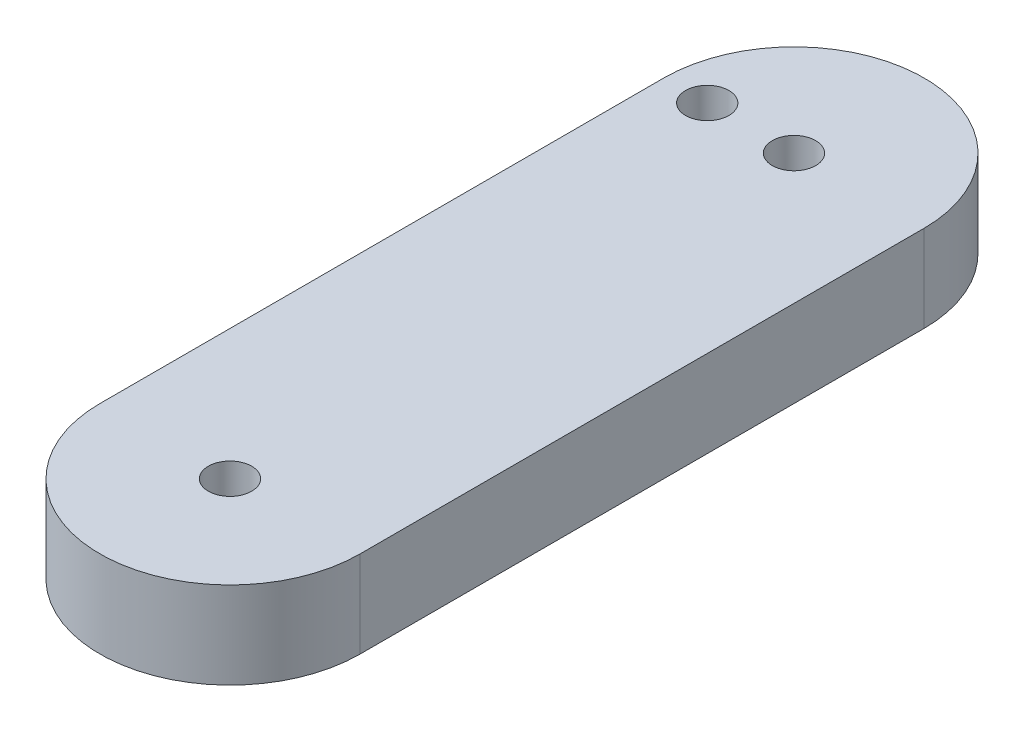
ISO-10303-21;
HEADER;
FILE_DESCRIPTION(('STEP AP214'),'2;1');
FILE_NAME('part.step','',(''),(''),'','','');
FILE_SCHEMA(('AUTOMOTIVE_DESIGN { 1 0 10303 214 1 1 1 1 }'));
ENDSEC;
DATA;
#1=APPLICATION_CONTEXT('core data for automotive mechanical design processes');
#2=APPLICATION_PROTOCOL_DEFINITION('international standard','automotive_design',2000,#1);
#3=PRODUCT_CONTEXT('',#1,'mechanical');
#4=PRODUCT('Part','Part','',(#3));
#5=PRODUCT_RELATED_PRODUCT_CATEGORY('part','',(#4));
#6=PRODUCT_DEFINITION_FORMATION('','',#4);
#7=PRODUCT_DEFINITION_CONTEXT('part definition',#1,'design');
#8=PRODUCT_DEFINITION('design','',#6,#7);
#9=PRODUCT_DEFINITION_SHAPE('','',#8);
#10=(LENGTH_UNIT() NAMED_UNIT(*) SI_UNIT(.MILLI.,.METRE.));
#11=(NAMED_UNIT(*) PLANE_ANGLE_UNIT() SI_UNIT($,.RADIAN.));
#12=(NAMED_UNIT(*) SI_UNIT($,.STERADIAN.) SOLID_ANGLE_UNIT());
#13=UNCERTAINTY_MEASURE_WITH_UNIT(LENGTH_MEASURE(1.E-05),#10,'distance_accuracy_value','');
#14=(GEOMETRIC_REPRESENTATION_CONTEXT(3) GLOBAL_UNCERTAINTY_ASSIGNED_CONTEXT((#13)) GLOBAL_UNIT_ASSIGNED_CONTEXT((#10,
#11,#12)) REPRESENTATION_CONTEXT('',''));
#15=CARTESIAN_POINT('',(0.,0.,0.));
#16=DIRECTION('',(0.,0.,1.));
#17=DIRECTION('',(1.,0.,0.));
#18=AXIS2_PLACEMENT_3D('',#15,#16,#17);
#19=CARTESIAN_POINT('',(15.,10.,0.));
#20=DIRECTION('',(0.,-1.,0.));
#21=DIRECTION('',(0.,0.,-1.));
#22=AXIS2_PLACEMENT_3D('',#19,#20,#21);
#23=CYLINDRICAL_SURFACE('',#22,15.);
#24=CARTESIAN_POINT('',(15.,0.,0.));
#25=DIRECTION('',(0.,1.,0.));
#26=DIRECTION('',(0.,0.,-1.));
#27=AXIS2_PLACEMENT_3D('',#24,#25,#26);
#28=CIRCLE('',#27,15.);
#29=CARTESIAN_POINT('',(0.,0.,0.));
#30=VERTEX_POINT('',#29);
#31=CARTESIAN_POINT('',(30.,0.,0.));
#32=VERTEX_POINT('',#31);
#33=EDGE_CURVE('E113',#30,#32,#28,.T.);
#34=ORIENTED_EDGE('',*,*,#33,.T.);
#35=DIRECTION('',(0.,-1.,0.));
#36=VECTOR('',#35,1.);
#37=CARTESIAN_POINT('',(30.,10.,0.));
#38=LINE('',#37,#36);
#39=CARTESIAN_POINT('',(30.,10.,0.));
#40=VERTEX_POINT('',#39);
#41=EDGE_CURVE('E11',#40,#32,#38,.T.);
#42=ORIENTED_EDGE('',*,*,#41,.F.);
#43=CARTESIAN_POINT('',(15.,10.,0.));
#44=DIRECTION('',(0.,1.,0.));
#45=DIRECTION('',(0.,0.,-1.));
#46=AXIS2_PLACEMENT_3D('',#43,#44,#45);
#47=CIRCLE('',#46,15.);
#48=CARTESIAN_POINT('',(0.,10.,0.));
#49=VERTEX_POINT('',#48);
#50=EDGE_CURVE('E97',#49,#40,#47,.T.);
#51=ORIENTED_EDGE('',*,*,#50,.F.);
#52=DIRECTION('',(0.,-1.,0.));
#53=VECTOR('',#52,1.);
#54=CARTESIAN_POINT('',(0.,10.,0.));
#55=LINE('',#54,#53);
#56=EDGE_CURVE('E109',#49,#30,#55,.T.);
#57=ORIENTED_EDGE('',*,*,#56,.T.);
#58=EDGE_LOOP('',(#34,#42,#51,#57));
#59=FACE_BOUND('',#58,.T.);
#60=ADVANCED_FACE('F45',(#59),#23,.T.);
#61=CARTESIAN_POINT('',(30.,10.,-65.));
#62=DIRECTION('',(-1.,0.,0.));
#63=DIRECTION('',(0.,0.,1.));
#64=AXIS2_PLACEMENT_3D('',#61,#62,#63);
#65=PLANE('',#64);
#66=DIRECTION('',(0.,0.,-1.));
#67=VECTOR('',#66,1.);
#68=CARTESIAN_POINT('',(30.,0.,-65.));
#69=LINE('',#68,#67);
#70=CARTESIAN_POINT('',(30.,0.,-65.));
#71=VERTEX_POINT('',#70);
#72=EDGE_CURVE('E102',#32,#71,#69,.T.);
#73=ORIENTED_EDGE('',*,*,#72,.T.);
#74=DIRECTION('',(0.,-1.,0.));
#75=VECTOR('',#74,1.);
#76=CARTESIAN_POINT('',(30.,10.,-65.));
#77=LINE('',#76,#75);
#78=CARTESIAN_POINT('',(30.,10.,-65.));
#79=VERTEX_POINT('',#78);
#80=EDGE_CURVE('E54',#79,#71,#77,.T.);
#81=ORIENTED_EDGE('',*,*,#80,.F.);
#82=DIRECTION('',(0.,0.,-1.));
#83=VECTOR('',#82,1.);
#84=CARTESIAN_POINT('',(30.,10.,-65.));
#85=LINE('',#84,#83);
#86=EDGE_CURVE('E92',#40,#79,#85,.T.);
#87=ORIENTED_EDGE('',*,*,#86,.F.);
#88=ORIENTED_EDGE('',*,*,#41,.T.);
#89=EDGE_LOOP('',(#73,#81,#87,#88));
#90=FACE_BOUND('',#89,.T.);
#91=ADVANCED_FACE('F101',(#90),#65,.F.);
#92=CARTESIAN_POINT('',(15.,10.,-65.));
#93=DIRECTION('',(0.,-1.,0.));
#94=DIRECTION('',(0.,0.,-1.));
#95=AXIS2_PLACEMENT_3D('',#92,#93,#94);
#96=CYLINDRICAL_SURFACE('',#95,15.);
#97=CARTESIAN_POINT('',(15.,0.,-65.));
#98=DIRECTION('',(0.,1.,0.));
#99=DIRECTION('',(0.,0.,-1.));
#100=AXIS2_PLACEMENT_3D('',#97,#98,#99);
#101=CIRCLE('',#100,15.);
#102=CARTESIAN_POINT('',(0.,0.,-65.));
#103=VERTEX_POINT('',#102);
#104=EDGE_CURVE('E79',#71,#103,#101,.T.);
#105=ORIENTED_EDGE('',*,*,#104,.T.);
#106=DIRECTION('',(0.,-1.,0.));
#107=VECTOR('',#106,1.);
#108=CARTESIAN_POINT('',(0.,10.,-65.));
#109=LINE('',#108,#107);
#110=CARTESIAN_POINT('',(0.,10.,-65.));
#111=VERTEX_POINT('',#110);
#112=EDGE_CURVE('E104',#111,#103,#109,.T.);
#113=ORIENTED_EDGE('',*,*,#112,.F.);
#114=CARTESIAN_POINT('',(15.,10.,-65.));
#115=DIRECTION('',(0.,1.,0.));
#116=DIRECTION('',(0.,0.,-1.));
#117=AXIS2_PLACEMENT_3D('',#114,#115,#116);
#118=CIRCLE('',#117,15.);
#119=EDGE_CURVE('E95',#79,#111,#118,.T.);
#120=ORIENTED_EDGE('',*,*,#119,.F.);
#121=ORIENTED_EDGE('',*,*,#80,.T.);
#122=EDGE_LOOP('',(#105,#113,#120,#121));
#123=FACE_BOUND('',#122,.T.);
#124=ADVANCED_FACE('F105',(#123),#96,.T.);
#125=CARTESIAN_POINT('',(0.,10.,0.));
#126=DIRECTION('',(1.,0.,0.));
#127=DIRECTION('',(0.,0.,-1.));
#128=AXIS2_PLACEMENT_3D('',#125,#126,#127);
#129=PLANE('',#128);
#130=DIRECTION('',(0.,0.,1.));
#131=VECTOR('',#130,1.);
#132=CARTESIAN_POINT('',(0.,0.,0.));
#133=LINE('',#132,#131);
#134=EDGE_CURVE('E85',#103,#30,#133,.T.);
#135=ORIENTED_EDGE('',*,*,#134,.T.);
#136=ORIENTED_EDGE('',*,*,#56,.F.);
#137=DIRECTION('',(0.,0.,1.));
#138=VECTOR('',#137,1.);
#139=CARTESIAN_POINT('',(0.,10.,0.));
#140=LINE('',#139,#138);
#141=EDGE_CURVE('E62',#111,#49,#140,.T.);
#142=ORIENTED_EDGE('',*,*,#141,.F.);
#143=ORIENTED_EDGE('',*,*,#112,.T.);
#144=EDGE_LOOP('',(#135,#136,#142,#143));
#145=FACE_BOUND('',#144,.T.);
#146=ADVANCED_FACE('F127',(#145),#129,.F.);
#147=CARTESIAN_POINT('',(15.,10.,0.));
#148=DIRECTION('',(0.,-1.,0.));
#149=DIRECTION('',(0.,0.,-1.));
#150=AXIS2_PLACEMENT_3D('',#147,#148,#149);
#151=PLANE('',#150);
#152=CARTESIAN_POINT('',(4.99999999999999,10.,-65.));
#153=DIRECTION('',(0.,1.,0.));
#154=DIRECTION('',(0.,0.,1.));
#155=AXIS2_PLACEMENT_3D('',#152,#153,#154);
#156=CIRCLE('',#155,2.5);
#157=CARTESIAN_POINT('',(4.99999999999999,10.,-62.5));
#158=VERTEX_POINT('',#157);
#159=EDGE_CURVE('E150',#158,#158,#156,.T.);
#160=ORIENTED_EDGE('',*,*,#159,.F.);
#161=EDGE_LOOP('',(#160));
#162=FACE_BOUND('',#161,.T.);
#163=CARTESIAN_POINT('',(15.,10.,-65.));
#164=DIRECTION('',(0.,-1.,0.));
#165=DIRECTION('',(0.,0.,-1.));
#166=AXIS2_PLACEMENT_3D('',#163,#164,#165);
#167=CIRCLE('',#166,2.5);
#168=CARTESIAN_POINT('',(15.,10.,-67.5));
#169=VERTEX_POINT('',#168);
#170=EDGE_CURVE('E117',#169,#169,#167,.T.);
#171=ORIENTED_EDGE('',*,*,#170,.T.);
#172=EDGE_LOOP('',(#171));
#173=FACE_BOUND('',#172,.T.);
#174=CARTESIAN_POINT('',(15.,10.,0.));
#175=DIRECTION('',(0.,-1.,0.));
#176=DIRECTION('',(0.,0.,-1.));
#177=AXIS2_PLACEMENT_3D('',#174,#175,#176);
#178=CIRCLE('',#177,2.5);
#179=CARTESIAN_POINT('',(15.,10.,-2.5));
#180=VERTEX_POINT('',#179);
#181=EDGE_CURVE('E137',#180,#180,#178,.T.);
#182=ORIENTED_EDGE('',*,*,#181,.T.);
#183=EDGE_LOOP('',(#182));
#184=FACE_BOUND('',#183,.T.);
#185=ORIENTED_EDGE('',*,*,#50,.T.);
#186=ORIENTED_EDGE('',*,*,#86,.T.);
#187=ORIENTED_EDGE('',*,*,#119,.T.);
#188=ORIENTED_EDGE('',*,*,#141,.T.);
#189=EDGE_LOOP('',(#185,#186,#187,#188));
#190=FACE_BOUND('',#189,.T.);
#191=ADVANCED_FACE('F93',(#162,#173,#184,#190),#151,.F.);
#192=CARTESIAN_POINT('',(15.,0.,0.));
#193=DIRECTION('',(0.,-1.,0.));
#194=DIRECTION('',(0.,0.,-1.));
#195=AXIS2_PLACEMENT_3D('',#192,#193,#194);
#196=PLANE('',#195);
#197=CARTESIAN_POINT('',(4.99999999999999,0.,-65.));
#198=DIRECTION('',(0.,1.,0.));
#199=DIRECTION('',(0.,0.,1.));
#200=AXIS2_PLACEMENT_3D('',#197,#198,#199);
#201=CIRCLE('',#200,2.5);
#202=CARTESIAN_POINT('',(4.99999999999999,0.,-62.5));
#203=VERTEX_POINT('',#202);
#204=EDGE_CURVE('E146',#203,#203,#201,.T.);
#205=ORIENTED_EDGE('',*,*,#204,.T.);
#206=EDGE_LOOP('',(#205));
#207=FACE_BOUND('',#206,.T.);
#208=CARTESIAN_POINT('',(15.,0.,-65.));
#209=DIRECTION('',(0.,1.,0.));
#210=DIRECTION('',(0.,0.,1.));
#211=AXIS2_PLACEMENT_3D('',#208,#209,#210);
#212=CIRCLE('',#211,2.5);
#213=CARTESIAN_POINT('',(15.,0.,-62.5));
#214=VERTEX_POINT('',#213);
#215=EDGE_CURVE('E141',#214,#214,#212,.T.);
#216=ORIENTED_EDGE('',*,*,#215,.T.);
#217=EDGE_LOOP('',(#216));
#218=FACE_BOUND('',#217,.T.);
#219=CARTESIAN_POINT('',(15.,0.,0.));
#220=DIRECTION('',(0.,1.,0.));
#221=DIRECTION('',(0.,0.,-1.));
#222=AXIS2_PLACEMENT_3D('',#219,#220,#221);
#223=CIRCLE('',#222,2.5);
#224=CARTESIAN_POINT('',(15.,0.,-2.5));
#225=VERTEX_POINT('',#224);
#226=EDGE_CURVE('E142',#225,#225,#223,.T.);
#227=ORIENTED_EDGE('',*,*,#226,.T.);
#228=EDGE_LOOP('',(#227));
#229=FACE_BOUND('',#228,.T.);
#230=ORIENTED_EDGE('',*,*,#33,.F.);
#231=ORIENTED_EDGE('',*,*,#134,.F.);
#232=ORIENTED_EDGE('',*,*,#104,.F.);
#233=ORIENTED_EDGE('',*,*,#72,.F.);
#234=EDGE_LOOP('',(#230,#231,#232,#233));
#235=FACE_BOUND('',#234,.T.);
#236=ADVANCED_FACE('F130',(#207,#218,#229,#235),#196,.T.);
#237=CARTESIAN_POINT('',(15.,0.,0.));
#238=DIRECTION('',(0.,1.,0.));
#239=DIRECTION('',(0.,0.,1.));
#240=AXIS2_PLACEMENT_3D('',#237,#238,#239);
#241=CYLINDRICAL_SURFACE('',#240,2.5);
#242=ORIENTED_EDGE('',*,*,#226,.F.);
#243=EDGE_LOOP('',(#242));
#244=FACE_BOUND('',#243,.T.);
#245=ORIENTED_EDGE('',*,*,#181,.F.);
#246=EDGE_LOOP('',(#245));
#247=FACE_BOUND('',#246,.T.);
#248=ADVANCED_FACE('F174',(#244,#247),#241,.F.);
#249=CARTESIAN_POINT('',(15.,0.,-65.));
#250=DIRECTION('',(0.,1.,0.));
#251=DIRECTION('',(0.,0.,1.));
#252=AXIS2_PLACEMENT_3D('',#249,#250,#251);
#253=CYLINDRICAL_SURFACE('',#252,2.5);
#254=ORIENTED_EDGE('',*,*,#215,.F.);
#255=EDGE_LOOP('',(#254));
#256=FACE_BOUND('',#255,.T.);
#257=ORIENTED_EDGE('',*,*,#170,.F.);
#258=EDGE_LOOP('',(#257));
#259=FACE_BOUND('',#258,.T.);
#260=ADVANCED_FACE('F163',(#256,#259),#253,.F.);
#261=CARTESIAN_POINT('',(4.99999999999999,0.,-65.));
#262=DIRECTION('',(0.,1.,0.));
#263=DIRECTION('',(0.,0.,1.));
#264=AXIS2_PLACEMENT_3D('',#261,#262,#263);
#265=CYLINDRICAL_SURFACE('',#264,2.5);
#266=ORIENTED_EDGE('',*,*,#204,.F.);
#267=EDGE_LOOP('',(#266));
#268=FACE_BOUND('',#267,.T.);
#269=ORIENTED_EDGE('',*,*,#159,.T.);
#270=EDGE_LOOP('',(#269));
#271=FACE_BOUND('',#270,.T.);
#272=ADVANCED_FACE('F160',(#268,#271),#265,.F.);
#273=CLOSED_SHELL('',(#60,#91,#124,#146,#191,#236,#248,#260,#272));
#274=MANIFOLD_SOLID_BREP('B2',#273);
#275=ADVANCED_BREP_SHAPE_REPRESENTATION('',(#18,#274),#14);
#276=SHAPE_DEFINITION_REPRESENTATION(#9,#275);
ENDSEC;
END-ISO-10303-21;
